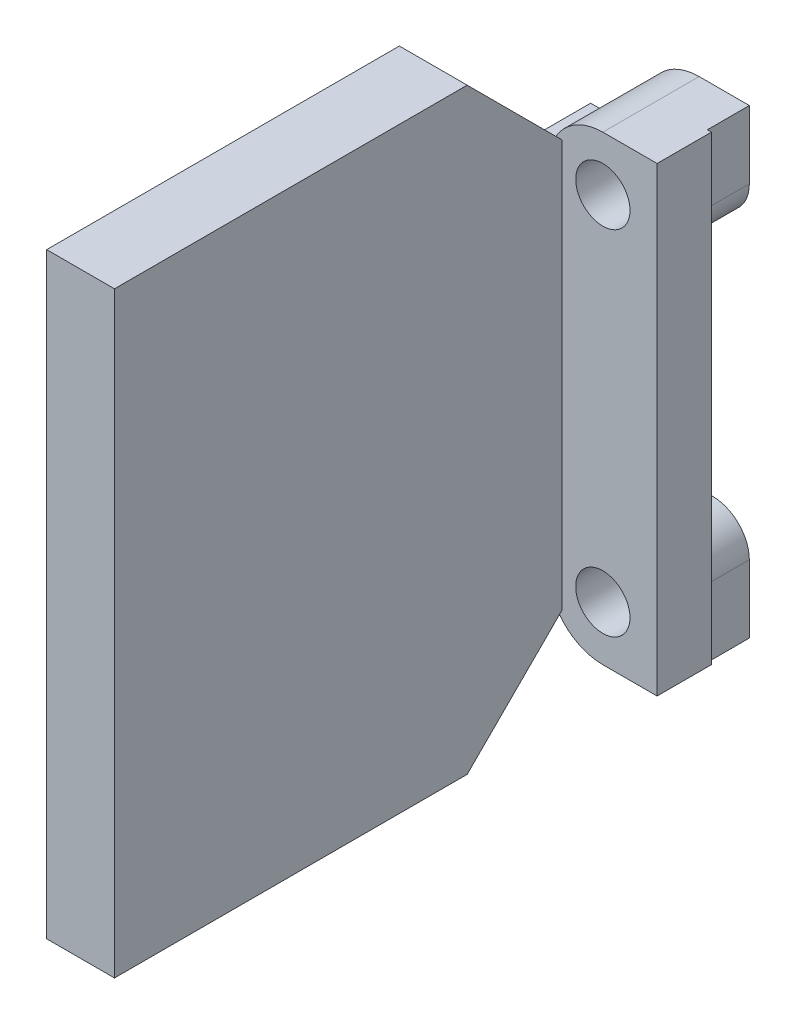
ISO-10303-21;
HEADER;
FILE_DESCRIPTION(('STEP AP214'),'2;1');
FILE_NAME('part.step','',(''),(''),'','','');
FILE_SCHEMA(('AUTOMOTIVE_DESIGN { 1 0 10303 214 1 1 1 1 }'));
ENDSEC;
DATA;
#1=APPLICATION_CONTEXT('core data for automotive mechanical design processes');
#2=APPLICATION_PROTOCOL_DEFINITION('international standard','automotive_design',2000,#1);
#3=PRODUCT_CONTEXT('',#1,'mechanical');
#4=PRODUCT('Part','Part','',(#3));
#5=PRODUCT_RELATED_PRODUCT_CATEGORY('part','',(#4));
#6=PRODUCT_DEFINITION_FORMATION('','',#4);
#7=PRODUCT_DEFINITION_CONTEXT('part definition',#1,'design');
#8=PRODUCT_DEFINITION('design','',#6,#7);
#9=PRODUCT_DEFINITION_SHAPE('','',#8);
#10=(LENGTH_UNIT() NAMED_UNIT(*) SI_UNIT(.MILLI.,.METRE.));
#11=(NAMED_UNIT(*) PLANE_ANGLE_UNIT() SI_UNIT($,.RADIAN.));
#12=(NAMED_UNIT(*) SI_UNIT($,.STERADIAN.) SOLID_ANGLE_UNIT());
#13=UNCERTAINTY_MEASURE_WITH_UNIT(LENGTH_MEASURE(1.E-05),#10,'distance_accuracy_value','');
#14=(GEOMETRIC_REPRESENTATION_CONTEXT(3) GLOBAL_UNCERTAINTY_ASSIGNED_CONTEXT((#13)) GLOBAL_UNIT_ASSIGNED_CONTEXT((#10,
#11,#12)) REPRESENTATION_CONTEXT('',''));
#15=CARTESIAN_POINT('',(0.,0.,0.));
#16=DIRECTION('',(0.,0.,1.));
#17=DIRECTION('',(1.,0.,0.));
#18=AXIS2_PLACEMENT_3D('',#15,#16,#17);
#19=CARTESIAN_POINT('',(-36.0000000000001,13.0000000000001,4.));
#20=DIRECTION('',(0.,0.,1.));
#21=DIRECTION('',(1.,0.,0.));
#22=AXIS2_PLACEMENT_3D('',#19,#20,#21);
#23=PLANE('',#22);
#24=CARTESIAN_POINT('',(-36.0000000000001,13.0000000000001,4.));
#25=DIRECTION('',(0.,0.,1.));
#26=DIRECTION('',(1.,0.,0.));
#27=AXIS2_PLACEMENT_3D('',#24,#25,#26);
#28=CIRCLE('',#27,2.);
#29=CARTESIAN_POINT('',(-34.0000000000001,13.0000000000001,4.));
#30=VERTEX_POINT('',#29);
#31=EDGE_CURVE('E374',#30,#30,#28,.T.);
#32=ORIENTED_EDGE('',*,*,#31,.F.);
#33=EDGE_LOOP('',(#32));
#34=FACE_BOUND('',#33,.T.);
#35=CARTESIAN_POINT('',(-36.0000000000001,13.0000000000001,4.));
#36=DIRECTION('',(0.,0.,1.));
#37=DIRECTION('',(1.,0.,0.));
#38=AXIS2_PLACEMENT_3D('',#35,#36,#37);
#39=CIRCLE('',#38,4.);
#40=CARTESIAN_POINT('',(-36.0000000000001,17.0000000000001,4.));
#41=VERTEX_POINT('',#40);
#42=CARTESIAN_POINT('',(-39.4641016151379,15.,4.));
#43=VERTEX_POINT('',#42);
#44=EDGE_CURVE('E383',#41,#43,#39,.T.);
#45=ORIENTED_EDGE('',*,*,#44,.T.);
#46=DIRECTION('',(1.,0.,0.));
#47=VECTOR('',#46,1.);
#48=CARTESIAN_POINT('',(-36.0000000000001,15.,4.));
#49=LINE('',#48,#47);
#50=CARTESIAN_POINT('',(-39.0000000000001,15.,4.));
#51=VERTEX_POINT('',#50);
#52=EDGE_CURVE('E339',#43,#51,#49,.T.);
#53=ORIENTED_EDGE('',*,*,#52,.T.);
#54=DIRECTION('',(0.,1.,0.));
#55=VECTOR('',#54,1.);
#56=CARTESIAN_POINT('',(-39.0000000000001,13.0000000000001,4.));
#57=LINE('',#56,#55);
#58=CARTESIAN_POINT('',(-39.0000000000001,-15.,4.));
#59=VERTEX_POINT('',#58);
#60=EDGE_CURVE('E333',#59,#51,#57,.T.);
#61=ORIENTED_EDGE('',*,*,#60,.F.);
#62=DIRECTION('',(1.,0.,0.));
#63=VECTOR('',#62,1.);
#64=CARTESIAN_POINT('',(-36.0000000000001,-15.,4.));
#65=LINE('',#64,#63);
#66=CARTESIAN_POINT('',(-39.4641016151379,-15.,4.));
#67=VERTEX_POINT('',#66);
#68=EDGE_CURVE('E220',#67,#59,#65,.T.);
#69=ORIENTED_EDGE('',*,*,#68,.F.);
#70=CARTESIAN_POINT('',(-36.0000000000001,-13.0000000000001,4.));
#71=DIRECTION('',(0.,0.,-1.));
#72=DIRECTION('',(1.,0.,0.));
#73=AXIS2_PLACEMENT_3D('',#70,#71,#72);
#74=CIRCLE('',#73,4.);
#75=CARTESIAN_POINT('',(-36.0000000000001,-17.0000000000001,4.));
#76=VERTEX_POINT('',#75);
#77=EDGE_CURVE('E286',#76,#67,#74,.T.);
#78=ORIENTED_EDGE('',*,*,#77,.F.);
#79=DIRECTION('',(-1.,0.,0.));
#80=VECTOR('',#79,1.);
#81=CARTESIAN_POINT('',(-36.0000000000001,-17.0000000000001,4.));
#82=LINE('',#81,#80);
#83=CARTESIAN_POINT('',(-32.,-17.0000000000001,4.));
#84=VERTEX_POINT('',#83);
#85=EDGE_CURVE('E283',#84,#76,#82,.T.);
#86=ORIENTED_EDGE('',*,*,#85,.F.);
#87=DIRECTION('',(0.,1.,0.));
#88=VECTOR('',#87,1.);
#89=CARTESIAN_POINT('',(-32.,0.,4.));
#90=LINE('',#89,#88);
#91=CARTESIAN_POINT('',(-32.,17.0000000000001,4.));
#92=VERTEX_POINT('',#91);
#93=EDGE_CURVE('E378',#84,#92,#90,.T.);
#94=ORIENTED_EDGE('',*,*,#93,.T.);
#95=DIRECTION('',(-1.,0.,0.));
#96=VECTOR('',#95,1.);
#97=CARTESIAN_POINT('',(-36.0000000000001,17.0000000000001,4.));
#98=LINE('',#97,#96);
#99=EDGE_CURVE('E380',#92,#41,#98,.T.);
#100=ORIENTED_EDGE('',*,*,#99,.T.);
#101=EDGE_LOOP('',(#45,#53,#61,#69,#78,#86,#94,#100));
#102=FACE_BOUND('',#101,.T.);
#103=CARTESIAN_POINT('',(-36.0000000000001,-13.0000000000001,4.));
#104=DIRECTION('',(0.,0.,-1.));
#105=DIRECTION('',(1.,0.,0.));
#106=AXIS2_PLACEMENT_3D('',#103,#104,#105);
#107=CIRCLE('',#106,2.);
#108=CARTESIAN_POINT('',(-34.0000000000001,-13.0000000000001,4.));
#109=VERTEX_POINT('',#108);
#110=EDGE_CURVE('E279',#109,#109,#107,.T.);
#111=ORIENTED_EDGE('',*,*,#110,.T.);
#112=EDGE_LOOP('',(#111));
#113=FACE_BOUND('',#112,.T.);
#114=ADVANCED_FACE('F36',(#34,#102,#113),#23,.T.);
#115=CARTESIAN_POINT('',(-36.0000000000001,13.0000000000001,4.));
#116=DIRECTION('',(0.,0.,-1.));
#117=DIRECTION('',(-1.,0.,0.));
#118=AXIS2_PLACEMENT_3D('',#115,#116,#117);
#119=CYLINDRICAL_SURFACE('',#118,4.);
#120=CARTESIAN_POINT('',(-36.0000000000001,13.0000000000001,2.0000000000001));
#121=DIRECTION('',(0.,-0.707106781186548,0.707106781186547));
#122=DIRECTION('',(0.,-0.707106781186547,-0.707106781186548));
#123=AXIS2_PLACEMENT_3D('',#120,#121,#122);
#124=ELLIPSE('',#123,5.65685424949238,4.);
#125=CARTESIAN_POINT('',(-40.0000000000001,13.0000000000001,2.00000000000011));
#126=VERTEX_POINT('',#125);
#127=EDGE_CURVE('E337',#43,#126,#124,.T.);
#128=ORIENTED_EDGE('',*,*,#127,.F.);
#129=ORIENTED_EDGE('',*,*,#44,.F.);
#130=DIRECTION('',(0.,0.,-1.));
#131=VECTOR('',#130,1.);
#132=CARTESIAN_POINT('',(-36.0000000000001,17.0000000000001,4.));
#133=LINE('',#132,#131);
#134=CARTESIAN_POINT('',(-36.0000000000001,17.0000000000001,-3.1));
#135=VERTEX_POINT('',#134);
#136=EDGE_CURVE('E393',#41,#135,#133,.T.);
#137=ORIENTED_EDGE('',*,*,#136,.T.);
#138=CARTESIAN_POINT('',(-36.0000000000001,13.0000000000001,-3.1));
#139=DIRECTION('',(0.,0.,1.));
#140=DIRECTION('',(1.,0.,0.));
#141=AXIS2_PLACEMENT_3D('',#138,#139,#140);
#142=CIRCLE('',#141,3.99999999999998);
#143=CARTESIAN_POINT('',(-40.0000000000001,13.0000000000001,-3.1));
#144=VERTEX_POINT('',#143);
#145=EDGE_CURVE('E364',#135,#144,#142,.T.);
#146=ORIENTED_EDGE('',*,*,#145,.T.);
#147=DIRECTION('',(0.,0.,-1.));
#148=VECTOR('',#147,1.);
#149=CARTESIAN_POINT('',(-40.0000000000001,13.0000000000001,4.));
#150=LINE('',#149,#148);
#151=EDGE_CURVE('E386',#126,#144,#150,.T.);
#152=ORIENTED_EDGE('',*,*,#151,.F.);
#153=EDGE_LOOP('',(#128,#129,#137,#146,#152));
#154=FACE_BOUND('',#153,.T.);
#155=ADVANCED_FACE('F418',(#154),#119,.T.);
#156=CARTESIAN_POINT('',(-44.0000000000001,13.0000000000001,4.));
#157=DIRECTION('',(0.,0.,-1.));
#158=DIRECTION('',(-1.,0.,0.));
#159=AXIS2_PLACEMENT_3D('',#156,#157,#158);
#160=CYLINDRICAL_SURFACE('',#159,4.);
#161=DIRECTION('',(0.,0.,-1.));
#162=VECTOR('',#161,1.);
#163=CARTESIAN_POINT('',(-40.3792266019539,11.3,4.));
#164=LINE('',#163,#162);
#165=CARTESIAN_POINT('',(-40.3792266019539,11.3,0.299999999999972));
#166=VERTEX_POINT('',#165);
#167=CARTESIAN_POINT('',(-40.3792266019538,11.3,-3.1));
#168=VERTEX_POINT('',#167);
#169=EDGE_CURVE('E335',#166,#168,#164,.T.);
#170=ORIENTED_EDGE('',*,*,#169,.F.);
#171=CARTESIAN_POINT('',(-44.0000000000001,13.0000000000001,2.00000000000013));
#172=DIRECTION('',(0.,-0.707106781186548,0.707106781186547));
#173=DIRECTION('',(0.,-0.707106781186547,-0.707106781186548));
#174=AXIS2_PLACEMENT_3D('',#171,#172,#173);
#175=ELLIPSE('',#174,5.65685424949238,4.);
#176=EDGE_CURVE('E12',#126,#166,#175,.F.);
#177=ORIENTED_EDGE('',*,*,#176,.F.);
#178=ORIENTED_EDGE('',*,*,#151,.T.);
#179=CARTESIAN_POINT('',(-44.0000000000001,13.0000000000001,-3.1));
#180=DIRECTION('',(0.,0.,1.));
#181=DIRECTION('',(1.,0.,0.));
#182=AXIS2_PLACEMENT_3D('',#179,#180,#181);
#183=CIRCLE('',#182,4.00000000000002);
#184=EDGE_CURVE('E349',#144,#168,#183,.F.);
#185=ORIENTED_EDGE('',*,*,#184,.T.);
#186=EDGE_LOOP('',(#170,#177,#178,#185));
#187=FACE_BOUND('',#186,.T.);
#188=ADVANCED_FACE('F470',(#187),#160,.F.);
#189=CARTESIAN_POINT('',(-36.0000000000001,13.0000000000001,0.));
#190=DIRECTION('',(0.,0.,1.));
#191=DIRECTION('',(1.,0.,0.));
#192=AXIS2_PLACEMENT_3D('',#189,#190,#191);
#193=PLANE('',#192);
#194=DIRECTION('',(0.,1.,0.));
#195=VECTOR('',#194,1.);
#196=CARTESIAN_POINT('',(-32.,0.,0.));
#197=LINE('',#196,#195);
#198=CARTESIAN_POINT('',(-32.,-17.0000000000001,0.));
#199=VERTEX_POINT('',#198);
#200=CARTESIAN_POINT('',(-32.,17.0000000000001,0.));
#201=VERTEX_POINT('',#200);
#202=EDGE_CURVE('E377',#199,#201,#197,.T.);
#203=ORIENTED_EDGE('',*,*,#202,.F.);
#204=DIRECTION('',(-1.,0.,0.));
#205=VECTOR('',#204,1.);
#206=CARTESIAN_POINT('',(-36.0000000000001,-17.0000000000001,0.));
#207=LINE('',#206,#205);
#208=CARTESIAN_POINT('',(-32.3,-17.0000000000001,0.));
#209=VERTEX_POINT('',#208);
#210=EDGE_CURVE('E282',#199,#209,#207,.T.);
#211=ORIENTED_EDGE('',*,*,#210,.T.);
#212=DIRECTION('',(0.,1.,0.));
#213=VECTOR('',#212,1.);
#214=CARTESIAN_POINT('',(-32.3,-12.,0.));
#215=LINE('',#214,#213);
#216=CARTESIAN_POINT('',(-32.3,-12.,0.));
#217=VERTEX_POINT('',#216);
#218=EDGE_CURVE('E247',#209,#217,#215,.T.);
#219=ORIENTED_EDGE('',*,*,#218,.T.);
#220=CARTESIAN_POINT('',(-35.,-12.,0.));
#221=DIRECTION('',(0.,0.,1.));
#222=DIRECTION('',(-1.,0.,0.));
#223=AXIS2_PLACEMENT_3D('',#220,#221,#222);
#224=CIRCLE('',#223,2.7);
#225=CARTESIAN_POINT('',(-35.,-9.30000000000001,0.));
#226=VERTEX_POINT('',#225);
#227=EDGE_CURVE('E257',#217,#226,#224,.T.);
#228=ORIENTED_EDGE('',*,*,#227,.T.);
#229=DIRECTION('',(-1.,0.,0.));
#230=VECTOR('',#229,1.);
#231=CARTESIAN_POINT('',(-35.,-9.30000000000001,0.));
#232=LINE('',#231,#230);
#233=CARTESIAN_POINT('',(-44.0000000000001,-9.29999999999998,0.));
#234=VERTEX_POINT('',#233);
#235=EDGE_CURVE('E252',#226,#234,#232,.T.);
#236=ORIENTED_EDGE('',*,*,#235,.T.);
#237=DIRECTION('',(0.,-1.,0.));
#238=VECTOR('',#237,1.);
#239=CARTESIAN_POINT('',(-44.,0.,0.));
#240=LINE('',#239,#238);
#241=CARTESIAN_POINT('',(-44.0000000000001,9.29999999999998,0.));
#242=VERTEX_POINT('',#241);
#243=EDGE_CURVE('E381',#242,#234,#240,.T.);
#244=ORIENTED_EDGE('',*,*,#243,.F.);
#245=DIRECTION('',(-1.,0.,0.));
#246=VECTOR('',#245,1.);
#247=CARTESIAN_POINT('',(-35.,9.30000000000001,0.));
#248=LINE('',#247,#246);
#249=CARTESIAN_POINT('',(-35.,9.30000000000001,0.));
#250=VERTEX_POINT('',#249);
#251=EDGE_CURVE('E56',#250,#242,#248,.T.);
#252=ORIENTED_EDGE('',*,*,#251,.F.);
#253=CARTESIAN_POINT('',(-35.,12.,0.));
#254=DIRECTION('',(0.,0.,-1.));
#255=DIRECTION('',(-1.,0.,0.));
#256=AXIS2_PLACEMENT_3D('',#253,#254,#255);
#257=CIRCLE('',#256,2.7);
#258=CARTESIAN_POINT('',(-32.3,12.,0.));
#259=VERTEX_POINT('',#258);
#260=EDGE_CURVE('E51',#259,#250,#257,.T.);
#261=ORIENTED_EDGE('',*,*,#260,.F.);
#262=DIRECTION('',(0.,-1.,0.));
#263=VECTOR('',#262,1.);
#264=CARTESIAN_POINT('',(-32.3,12.,0.));
#265=LINE('',#264,#263);
#266=CARTESIAN_POINT('',(-32.3,17.0000000000001,0.));
#267=VERTEX_POINT('',#266);
#268=EDGE_CURVE('E343',#267,#259,#265,.T.);
#269=ORIENTED_EDGE('',*,*,#268,.F.);
#270=DIRECTION('',(-1.,0.,0.));
#271=VECTOR('',#270,1.);
#272=CARTESIAN_POINT('',(-36.0000000000001,17.0000000000001,0.));
#273=LINE('',#272,#271);
#274=EDGE_CURVE('E388',#201,#267,#273,.T.);
#275=ORIENTED_EDGE('',*,*,#274,.F.);
#276=EDGE_LOOP('',(#203,#211,#219,#228,#236,#244,#252,#261,#269,#275));
#277=FACE_BOUND('',#276,.T.);
#278=ADVANCED_FACE('F403',(#277),#193,.F.);
#279=CARTESIAN_POINT('',(-32.,0.,4.));
#280=DIRECTION('',(-1.,0.,0.));
#281=DIRECTION('',(0.,0.,1.));
#282=AXIS2_PLACEMENT_3D('',#279,#280,#281);
#283=PLANE('',#282);
#284=ORIENTED_EDGE('',*,*,#202,.T.);
#285=DIRECTION('',(0.,0.,-1.));
#286=VECTOR('',#285,1.);
#287=CARTESIAN_POINT('',(-32.,17.0000000000001,4.));
#288=LINE('',#287,#286);
#289=EDGE_CURVE('E44',#92,#201,#288,.T.);
#290=ORIENTED_EDGE('',*,*,#289,.F.);
#291=ORIENTED_EDGE('',*,*,#93,.F.);
#292=DIRECTION('',(0.,0.,-1.));
#293=VECTOR('',#292,1.);
#294=CARTESIAN_POINT('',(-32.,-17.0000000000001,4.));
#295=LINE('',#294,#293);
#296=EDGE_CURVE('E297',#84,#199,#295,.T.);
#297=ORIENTED_EDGE('',*,*,#296,.T.);
#298=EDGE_LOOP('',(#284,#290,#291,#297));
#299=FACE_BOUND('',#298,.T.);
#300=ADVANCED_FACE('F38',(#299),#283,.F.);
#301=CARTESIAN_POINT('',(-36.0000000000001,17.0000000000001,4.));
#302=DIRECTION('',(0.,-1.,0.));
#303=DIRECTION('',(0.,0.,-1.));
#304=AXIS2_PLACEMENT_3D('',#301,#302,#303);
#305=PLANE('',#304);
#306=ORIENTED_EDGE('',*,*,#274,.T.);
#307=DIRECTION('',(0.,0.,1.));
#308=VECTOR('',#307,1.);
#309=CARTESIAN_POINT('',(-32.3,17.0000000000001,-15.9642108679172));
#310=LINE('',#309,#308);
#311=CARTESIAN_POINT('',(-32.3,17.0000000000001,-3.1));
#312=VERTEX_POINT('',#311);
#313=EDGE_CURVE('E347',#312,#267,#310,.T.);
#314=ORIENTED_EDGE('',*,*,#313,.F.);
#315=DIRECTION('',(-1.,0.,0.));
#316=VECTOR('',#315,1.);
#317=CARTESIAN_POINT('',(-36.0000000000001,17.0000000000001,-3.1));
#318=LINE('',#317,#316);
#319=EDGE_CURVE('E367',#312,#135,#318,.T.);
#320=ORIENTED_EDGE('',*,*,#319,.T.);
#321=ORIENTED_EDGE('',*,*,#136,.F.);
#322=ORIENTED_EDGE('',*,*,#99,.F.);
#323=ORIENTED_EDGE('',*,*,#289,.T.);
#324=EDGE_LOOP('',(#306,#314,#320,#321,#322,#323));
#325=FACE_BOUND('',#324,.T.);
#326=ADVANCED_FACE('F399',(#325),#305,.F.);
#327=CARTESIAN_POINT('',(-44.,0.,4.));
#328=DIRECTION('',(1.,0.,0.));
#329=DIRECTION('',(0.,1.,0.));
#330=AXIS2_PLACEMENT_3D('',#327,#328,#329);
#331=PLANE('',#330);
#332=ORIENTED_EDGE('',*,*,#243,.T.);
#333=DIRECTION('',(0.,0.,-1.));
#334=VECTOR('',#333,1.);
#335=CARTESIAN_POINT('',(-44.0000000000001,-9.29999999999998,0.));
#336=LINE('',#335,#334);
#337=CARTESIAN_POINT('',(-44.0000000000001,-9.29999999999998,-3.1));
#338=VERTEX_POINT('',#337);
#339=EDGE_CURVE('E225',#234,#338,#336,.T.);
#340=ORIENTED_EDGE('',*,*,#339,.T.);
#341=DIRECTION('',(0.,-1.,0.));
#342=VECTOR('',#341,1.);
#343=CARTESIAN_POINT('',(-44.0000000000001,-9.29999999999998,-3.1));
#344=LINE('',#343,#342);
#345=CARTESIAN_POINT('',(-44.0000000000001,-11.3,-3.1));
#346=VERTEX_POINT('',#345);
#347=EDGE_CURVE('E228',#338,#346,#344,.T.);
#348=ORIENTED_EDGE('',*,*,#347,.T.);
#349=DIRECTION('',(0.,0.,1.));
#350=VECTOR('',#349,1.);
#351=CARTESIAN_POINT('',(-44.0000000000001,-11.3,-3.1));
#352=LINE('',#351,#350);
#353=CARTESIAN_POINT('',(-44.0000000000001,-11.3,0.299999999999972));
#354=VERTEX_POINT('',#353);
#355=EDGE_CURVE('E231',#346,#354,#352,.T.);
#356=ORIENTED_EDGE('',*,*,#355,.T.);
#357=DIRECTION('',(0.,-0.707106781186547,0.707106781186548));
#358=VECTOR('',#357,1.);
#359=CARTESIAN_POINT('',(-44.0000000000001,-11.3,0.299999999999972));
#360=LINE('',#359,#358);
#361=CARTESIAN_POINT('',(-44.0000000000001,-22.,11.));
#362=VERTEX_POINT('',#361);
#363=EDGE_CURVE('E222',#354,#362,#360,.T.);
#364=ORIENTED_EDGE('',*,*,#363,.T.);
#365=DIRECTION('',(0.,0.,1.));
#366=VECTOR('',#365,1.);
#367=CARTESIAN_POINT('',(-44.0000000000001,-22.,11.));
#368=LINE('',#367,#366);
#369=CARTESIAN_POINT('',(-44.0000000000001,-22.,37.));
#370=VERTEX_POINT('',#369);
#371=EDGE_CURVE('E212',#362,#370,#368,.T.);
#372=ORIENTED_EDGE('',*,*,#371,.T.);
#373=DIRECTION('',(0.,-1.,0.));
#374=VECTOR('',#373,1.);
#375=CARTESIAN_POINT('',(-44.0000000000001,22.,37.));
#376=LINE('',#375,#374);
#377=CARTESIAN_POINT('',(-44.0000000000001,22.,37.));
#378=VERTEX_POINT('',#377);
#379=EDGE_CURVE('E307',#378,#370,#376,.T.);
#380=ORIENTED_EDGE('',*,*,#379,.F.);
#381=DIRECTION('',(0.,0.,1.));
#382=VECTOR('',#381,1.);
#383=CARTESIAN_POINT('',(-44.0000000000001,22.,11.));
#384=LINE('',#383,#382);
#385=CARTESIAN_POINT('',(-44.0000000000001,22.,11.));
#386=VERTEX_POINT('',#385);
#387=EDGE_CURVE('E321',#386,#378,#384,.T.);
#388=ORIENTED_EDGE('',*,*,#387,.F.);
#389=DIRECTION('',(0.,0.707106781186547,0.707106781186548));
#390=VECTOR('',#389,1.);
#391=CARTESIAN_POINT('',(-44.0000000000001,11.3,0.299999999999972));
#392=LINE('',#391,#390);
#393=CARTESIAN_POINT('',(-44.0000000000001,11.3,0.299999999999972));
#394=VERTEX_POINT('',#393);
#395=EDGE_CURVE('E319',#394,#386,#392,.T.);
#396=ORIENTED_EDGE('',*,*,#395,.F.);
#397=DIRECTION('',(0.,0.,1.));
#398=VECTOR('',#397,1.);
#399=CARTESIAN_POINT('',(-44.0000000000001,11.3,-3.1));
#400=LINE('',#399,#398);
#401=CARTESIAN_POINT('',(-44.0000000000001,11.3,-3.1));
#402=VERTEX_POINT('',#401);
#403=EDGE_CURVE('E316',#402,#394,#400,.T.);
#404=ORIENTED_EDGE('',*,*,#403,.F.);
#405=DIRECTION('',(0.,1.,0.));
#406=VECTOR('',#405,1.);
#407=CARTESIAN_POINT('',(-44.0000000000001,9.29999999999998,-3.1));
#408=LINE('',#407,#406);
#409=CARTESIAN_POINT('',(-44.0000000000001,9.29999999999998,-3.1));
#410=VERTEX_POINT('',#409);
#411=EDGE_CURVE('E313',#410,#402,#408,.T.);
#412=ORIENTED_EDGE('',*,*,#411,.F.);
#413=DIRECTION('',(0.,0.,-1.));
#414=VECTOR('',#413,1.);
#415=CARTESIAN_POINT('',(-44.0000000000001,9.29999999999998,0.));
#416=LINE('',#415,#414);
#417=EDGE_CURVE('E303',#242,#410,#416,.T.);
#418=ORIENTED_EDGE('',*,*,#417,.F.);
#419=EDGE_LOOP('',(#332,#340,#348,#356,#364,#372,#380,#388,#396,#404,#412,#418));
#420=FACE_BOUND('',#419,.T.);
#421=ADVANCED_FACE('F448',(#420),#331,.F.);
#422=CARTESIAN_POINT('',(-36.0000000000001,13.0000000000001,4.));
#423=DIRECTION('',(0.,0.,-1.));
#424=DIRECTION('',(-1.,0.,0.));
#425=AXIS2_PLACEMENT_3D('',#422,#423,#424);
#426=CYLINDRICAL_SURFACE('',#425,2.);
#427=ORIENTED_EDGE('',*,*,#31,.T.);
#428=EDGE_LOOP('',(#427));
#429=FACE_BOUND('',#428,.T.);
#430=CARTESIAN_POINT('',(-36.0000000000001,13.0000000000001,-3.1));
#431=DIRECTION('',(0.,0.,1.));
#432=DIRECTION('',(1.,0.,0.));
#433=AXIS2_PLACEMENT_3D('',#430,#431,#432);
#434=CIRCLE('',#433,2.);
#435=CARTESIAN_POINT('',(-34.0000000000001,13.0000000000001,-3.1));
#436=VERTEX_POINT('',#435);
#437=EDGE_CURVE('E346',#436,#436,#434,.T.);
#438=ORIENTED_EDGE('',*,*,#437,.F.);
#439=EDGE_LOOP('',(#438));
#440=FACE_BOUND('',#439,.T.);
#441=ADVANCED_FACE('F454',(#429,#440),#426,.F.);
#442=CARTESIAN_POINT('',(-35.,12.,-15.9642108679172));
#443=DIRECTION('',(0.,0.,1.));
#444=DIRECTION('',(1.,0.,0.));
#445=AXIS2_PLACEMENT_3D('',#442,#443,#444);
#446=CYLINDRICAL_SURFACE('',#445,2.7);
#447=DIRECTION('',(0.,0.,1.));
#448=VECTOR('',#447,1.);
#449=CARTESIAN_POINT('',(-35.,9.30000000000001,-15.9642108679172));
#450=LINE('',#449,#448);
#451=CARTESIAN_POINT('',(-35.,9.30000000000001,-3.1));
#452=VERTEX_POINT('',#451);
#453=EDGE_CURVE('E350',#452,#250,#450,.T.);
#454=ORIENTED_EDGE('',*,*,#453,.F.);
#455=CARTESIAN_POINT('',(-35.,12.,-3.1));
#456=DIRECTION('',(0.,0.,1.));
#457=DIRECTION('',(1.,0.,0.));
#458=AXIS2_PLACEMENT_3D('',#455,#456,#457);
#459=CIRCLE('',#458,2.7);
#460=CARTESIAN_POINT('',(-32.3,12.,-3.1));
#461=VERTEX_POINT('',#460);
#462=EDGE_CURVE('E342',#452,#461,#459,.T.);
#463=ORIENTED_EDGE('',*,*,#462,.T.);
#464=DIRECTION('',(0.,0.,1.));
#465=VECTOR('',#464,1.);
#466=CARTESIAN_POINT('',(-32.3,12.,-15.9642108679172));
#467=LINE('',#466,#465);
#468=EDGE_CURVE('E353',#461,#259,#467,.T.);
#469=ORIENTED_EDGE('',*,*,#468,.T.);
#470=ORIENTED_EDGE('',*,*,#260,.T.);
#471=EDGE_LOOP('',(#454,#463,#469,#470));
#472=FACE_BOUND('',#471,.T.);
#473=ADVANCED_FACE('F452',(#472),#446,.T.);
#474=CARTESIAN_POINT('',(-35.,9.30000000000001,-15.9642108679172));
#475=DIRECTION('',(0.,1.,0.));
#476=DIRECTION('',(0.,0.,1.));
#477=AXIS2_PLACEMENT_3D('',#474,#475,#476);
#478=PLANE('',#477);
#479=ORIENTED_EDGE('',*,*,#251,.T.);
#480=ORIENTED_EDGE('',*,*,#417,.T.);
#481=DIRECTION('',(1.,0.,0.));
#482=VECTOR('',#481,1.);
#483=CARTESIAN_POINT('',(-35.,9.30000000000001,-3.1));
#484=LINE('',#483,#482);
#485=EDGE_CURVE('E352',#410,#452,#484,.T.);
#486=ORIENTED_EDGE('',*,*,#485,.T.);
#487=ORIENTED_EDGE('',*,*,#453,.T.);
#488=EDGE_LOOP('',(#479,#480,#486,#487));
#489=FACE_BOUND('',#488,.T.);
#490=ADVANCED_FACE('F445',(#489),#478,.F.);
#491=CARTESIAN_POINT('',(-32.3,12.,-15.9642108679172));
#492=DIRECTION('',(-1.,0.,0.));
#493=DIRECTION('',(0.,0.,1.));
#494=AXIS2_PLACEMENT_3D('',#491,#492,#493);
#495=PLANE('',#494);
#496=ORIENTED_EDGE('',*,*,#468,.F.);
#497=DIRECTION('',(0.,1.,0.));
#498=VECTOR('',#497,1.);
#499=CARTESIAN_POINT('',(-32.3,12.,-3.1));
#500=LINE('',#499,#498);
#501=EDGE_CURVE('E357',#461,#312,#500,.T.);
#502=ORIENTED_EDGE('',*,*,#501,.T.);
#503=ORIENTED_EDGE('',*,*,#313,.T.);
#504=ORIENTED_EDGE('',*,*,#268,.T.);
#505=EDGE_LOOP('',(#496,#502,#503,#504));
#506=FACE_BOUND('',#505,.T.);
#507=ADVANCED_FACE('F406',(#506),#495,.F.);
#508=CARTESIAN_POINT('',(-36.0000000000001,13.0000000000001,-3.1));
#509=DIRECTION('',(0.,0.,1.));
#510=DIRECTION('',(0.,-1.,0.));
#511=AXIS2_PLACEMENT_3D('',#508,#509,#510);
#512=PLANE('',#511);
#513=ORIENTED_EDGE('',*,*,#485,.F.);
#514=ORIENTED_EDGE('',*,*,#411,.T.);
#515=DIRECTION('',(-1.,0.,0.));
#516=VECTOR('',#515,1.);
#517=CARTESIAN_POINT('',(-39.0000000000001,11.3,-3.1));
#518=LINE('',#517,#516);
#519=EDGE_CURVE('E331',#168,#402,#518,.T.);
#520=ORIENTED_EDGE('',*,*,#519,.F.);
#521=ORIENTED_EDGE('',*,*,#184,.F.);
#522=ORIENTED_EDGE('',*,*,#145,.F.);
#523=ORIENTED_EDGE('',*,*,#319,.F.);
#524=ORIENTED_EDGE('',*,*,#501,.F.);
#525=ORIENTED_EDGE('',*,*,#462,.F.);
#526=EDGE_LOOP('',(#513,#514,#520,#521,#522,#523,#524,#525));
#527=FACE_BOUND('',#526,.T.);
#528=ORIENTED_EDGE('',*,*,#437,.T.);
#529=EDGE_LOOP('',(#528));
#530=FACE_BOUND('',#529,.T.);
#531=ADVANCED_FACE('F410',(#527,#530),#512,.F.);
#532=CARTESIAN_POINT('',(-39.0000000000001,11.3,-3.1));
#533=DIRECTION('',(0.,-1.,0.));
#534=DIRECTION('',(1.,0.,0.));
#535=AXIS2_PLACEMENT_3D('',#532,#533,#534);
#536=PLANE('',#535);
#537=DIRECTION('',(-1.,0.,0.));
#538=VECTOR('',#537,1.);
#539=CARTESIAN_POINT('',(-39.0000000000001,11.3,0.299999999999972));
#540=LINE('',#539,#538);
#541=EDGE_CURVE('E329',#166,#394,#540,.T.);
#542=ORIENTED_EDGE('',*,*,#541,.F.);
#543=ORIENTED_EDGE('',*,*,#169,.T.);
#544=ORIENTED_EDGE('',*,*,#519,.T.);
#545=ORIENTED_EDGE('',*,*,#403,.T.);
#546=EDGE_LOOP('',(#542,#543,#544,#545));
#547=FACE_BOUND('',#546,.T.);
#548=ADVANCED_FACE('F566',(#547),#536,.F.);
#549=CARTESIAN_POINT('',(-39.0000000000001,11.3,0.299999999999972));
#550=DIRECTION('',(0.,-0.707106781186548,0.707106781186547));
#551=DIRECTION('',(0.,-0.707106781186547,-0.707106781186548));
#552=AXIS2_PLACEMENT_3D('',#549,#550,#551);
#553=PLANE('',#552);
#554=ORIENTED_EDGE('',*,*,#52,.F.);
#555=ORIENTED_EDGE('',*,*,#127,.T.);
#556=ORIENTED_EDGE('',*,*,#176,.T.);
#557=ORIENTED_EDGE('',*,*,#541,.T.);
#558=ORIENTED_EDGE('',*,*,#395,.T.);
#559=DIRECTION('',(-1.,0.,0.));
#560=VECTOR('',#559,1.);
#561=CARTESIAN_POINT('',(-39.0000000000001,22.,11.));
#562=LINE('',#561,#560);
#563=CARTESIAN_POINT('',(-39.0000000000001,22.,11.));
#564=VERTEX_POINT('',#563);
#565=EDGE_CURVE('E326',#564,#386,#562,.T.);
#566=ORIENTED_EDGE('',*,*,#565,.F.);
#567=DIRECTION('',(0.,0.707106781186547,0.707106781186548));
#568=VECTOR('',#567,1.);
#569=CARTESIAN_POINT('',(-39.0000000000001,11.3,0.299999999999972));
#570=LINE('',#569,#568);
#571=EDGE_CURVE('E304',#51,#564,#570,.T.);
#572=ORIENTED_EDGE('',*,*,#571,.F.);
#573=EDGE_LOOP('',(#554,#555,#556,#557,#558,#566,#572));
#574=FACE_BOUND('',#573,.T.);
#575=ADVANCED_FACE('F574',(#574),#553,.F.);
#576=CARTESIAN_POINT('',(-39.0000000000001,22.,11.));
#577=DIRECTION('',(0.,-1.,0.));
#578=DIRECTION('',(1.,0.,0.));
#579=AXIS2_PLACEMENT_3D('',#576,#577,#578);
#580=PLANE('',#579);
#581=ORIENTED_EDGE('',*,*,#387,.T.);
#582=DIRECTION('',(-1.,0.,0.));
#583=VECTOR('',#582,1.);
#584=CARTESIAN_POINT('',(-39.0000000000001,22.,37.));
#585=LINE('',#584,#583);
#586=CARTESIAN_POINT('',(-39.0000000000001,22.,37.));
#587=VERTEX_POINT('',#586);
#588=EDGE_CURVE('E310',#587,#378,#585,.T.);
#589=ORIENTED_EDGE('',*,*,#588,.F.);
#590=DIRECTION('',(0.,0.,1.));
#591=VECTOR('',#590,1.);
#592=CARTESIAN_POINT('',(-39.0000000000001,22.,11.));
#593=LINE('',#592,#591);
#594=EDGE_CURVE('E306',#564,#587,#593,.T.);
#595=ORIENTED_EDGE('',*,*,#594,.F.);
#596=ORIENTED_EDGE('',*,*,#565,.T.);
#597=EDGE_LOOP('',(#581,#589,#595,#596));
#598=FACE_BOUND('',#597,.T.);
#599=ADVANCED_FACE('F583',(#598),#580,.F.);
#600=CARTESIAN_POINT('',(-39.0000000000001,22.,37.));
#601=DIRECTION('',(0.,0.,-1.));
#602=DIRECTION('',(0.,1.,0.));
#603=AXIS2_PLACEMENT_3D('',#600,#601,#602);
#604=PLANE('',#603);
#605=ORIENTED_EDGE('',*,*,#379,.T.);
#606=DIRECTION('',(-1.,0.,0.));
#607=VECTOR('',#606,1.);
#608=CARTESIAN_POINT('',(-39.0000000000001,-22.,37.));
#609=LINE('',#608,#607);
#610=CARTESIAN_POINT('',(-39.0000000000001,-22.,37.));
#611=VERTEX_POINT('',#610);
#612=EDGE_CURVE('E206',#611,#370,#609,.T.);
#613=ORIENTED_EDGE('',*,*,#612,.F.);
#614=DIRECTION('',(0.,-1.,0.));
#615=VECTOR('',#614,1.);
#616=CARTESIAN_POINT('',(-39.0000000000001,22.,37.));
#617=LINE('',#616,#615);
#618=EDGE_CURVE('E202',#587,#611,#617,.T.);
#619=ORIENTED_EDGE('',*,*,#618,.F.);
#620=ORIENTED_EDGE('',*,*,#588,.T.);
#621=EDGE_LOOP('',(#605,#613,#619,#620));
#622=FACE_BOUND('',#621,.T.);
#623=ADVANCED_FACE('F591',(#622),#604,.F.);
#624=CARTESIAN_POINT('',(-39.,-2.82181685425561E-13,0.));
#625=DIRECTION('',(1.,0.,0.));
#626=DIRECTION('',(0.,1.,0.));
#627=AXIS2_PLACEMENT_3D('',#624,#625,#626);
#628=PLANE('',#627);
#629=ORIENTED_EDGE('',*,*,#618,.T.);
#630=DIRECTION('',(0.,0.,1.));
#631=VECTOR('',#630,1.);
#632=CARTESIAN_POINT('',(-39.0000000000001,-22.,11.));
#633=LINE('',#632,#631);
#634=CARTESIAN_POINT('',(-39.0000000000001,-22.,11.));
#635=VERTEX_POINT('',#634);
#636=EDGE_CURVE('E195',#635,#611,#633,.T.);
#637=ORIENTED_EDGE('',*,*,#636,.F.);
#638=DIRECTION('',(0.,-0.707106781186547,0.707106781186548));
#639=VECTOR('',#638,1.);
#640=CARTESIAN_POINT('',(-39.0000000000001,-11.3,0.299999999999972));
#641=LINE('',#640,#639);
#642=EDGE_CURVE('E199',#59,#635,#641,.T.);
#643=ORIENTED_EDGE('',*,*,#642,.F.);
#644=ORIENTED_EDGE('',*,*,#60,.T.);
#645=ORIENTED_EDGE('',*,*,#571,.T.);
#646=ORIENTED_EDGE('',*,*,#594,.T.);
#647=EDGE_LOOP('',(#629,#637,#643,#644,#645,#646));
#648=FACE_BOUND('',#647,.T.);
#649=ADVANCED_FACE('F197',(#648),#628,.T.);
#650=CARTESIAN_POINT('',(-36.0000000000001,-13.0000000000001,4.));
#651=DIRECTION('',(0.,0.,-1.));
#652=DIRECTION('',(-1.,0.,0.));
#653=AXIS2_PLACEMENT_3D('',#650,#651,#652);
#654=CYLINDRICAL_SURFACE('',#653,4.);
#655=CARTESIAN_POINT('',(-36.0000000000001,-13.0000000000001,2.0000000000001));
#656=DIRECTION('',(0.,-0.707106781186548,-0.707106781186547));
#657=DIRECTION('',(0.,0.707106781186547,-0.707106781186548));
#658=AXIS2_PLACEMENT_3D('',#655,#656,#657);
#659=ELLIPSE('',#658,5.65685424949238,4.);
#660=CARTESIAN_POINT('',(-40.0000000000001,-13.0000000000001,2.00000000000011));
#661=VERTEX_POINT('',#660);
#662=EDGE_CURVE('E242',#67,#661,#659,.T.);
#663=ORIENTED_EDGE('',*,*,#662,.T.);
#664=DIRECTION('',(0.,0.,-1.));
#665=VECTOR('',#664,1.);
#666=CARTESIAN_POINT('',(-40.0000000000001,-13.0000000000001,4.));
#667=LINE('',#666,#665);
#668=CARTESIAN_POINT('',(-40.0000000000001,-13.0000000000001,-3.1));
#669=VERTEX_POINT('',#668);
#670=EDGE_CURVE('E289',#661,#669,#667,.T.);
#671=ORIENTED_EDGE('',*,*,#670,.T.);
#672=CARTESIAN_POINT('',(-36.0000000000001,-13.0000000000001,-3.1));
#673=DIRECTION('',(0.,0.,-1.));
#674=DIRECTION('',(1.,0.,0.));
#675=AXIS2_PLACEMENT_3D('',#672,#673,#674);
#676=CIRCLE('',#675,3.99999999999998);
#677=CARTESIAN_POINT('',(-36.0000000000001,-17.0000000000001,-3.1));
#678=VERTEX_POINT('',#677);
#679=EDGE_CURVE('E271',#678,#669,#676,.T.);
#680=ORIENTED_EDGE('',*,*,#679,.F.);
#681=DIRECTION('',(0.,0.,-1.));
#682=VECTOR('',#681,1.);
#683=CARTESIAN_POINT('',(-36.0000000000001,-17.0000000000001,4.));
#684=LINE('',#683,#682);
#685=EDGE_CURVE('E294',#76,#678,#684,.T.);
#686=ORIENTED_EDGE('',*,*,#685,.F.);
#687=ORIENTED_EDGE('',*,*,#77,.T.);
#688=EDGE_LOOP('',(#663,#671,#680,#686,#687));
#689=FACE_BOUND('',#688,.T.);
#690=ADVANCED_FACE('F607',(#689),#654,.T.);
#691=CARTESIAN_POINT('',(-44.0000000000001,-13.0000000000001,4.));
#692=DIRECTION('',(0.,0.,-1.));
#693=DIRECTION('',(-1.,0.,0.));
#694=AXIS2_PLACEMENT_3D('',#691,#692,#693);
#695=CYLINDRICAL_SURFACE('',#694,4.);
#696=DIRECTION('',(0.,0.,-1.));
#697=VECTOR('',#696,1.);
#698=CARTESIAN_POINT('',(-40.3792266019539,-11.3,4.));
#699=LINE('',#698,#697);
#700=CARTESIAN_POINT('',(-40.3792266019539,-11.3,0.299999999999972));
#701=VERTEX_POINT('',#700);
#702=CARTESIAN_POINT('',(-40.3792266019538,-11.3,-3.1));
#703=VERTEX_POINT('',#702);
#704=EDGE_CURVE('E239',#701,#703,#699,.T.);
#705=ORIENTED_EDGE('',*,*,#704,.T.);
#706=CARTESIAN_POINT('',(-44.0000000000001,-13.0000000000001,-3.1));
#707=DIRECTION('',(0.,0.,-1.));
#708=DIRECTION('',(1.,0.,0.));
#709=AXIS2_PLACEMENT_3D('',#706,#707,#708);
#710=CIRCLE('',#709,4.00000000000002);
#711=EDGE_CURVE('E255',#669,#703,#710,.F.);
#712=ORIENTED_EDGE('',*,*,#711,.F.);
#713=ORIENTED_EDGE('',*,*,#670,.F.);
#714=CARTESIAN_POINT('',(-44.0000000000001,-13.0000000000001,2.00000000000013));
#715=DIRECTION('',(0.,-0.707106781186548,-0.707106781186547));
#716=DIRECTION('',(0.,0.707106781186547,-0.707106781186548));
#717=AXIS2_PLACEMENT_3D('',#714,#715,#716);
#718=ELLIPSE('',#717,5.65685424949238,4.);
#719=EDGE_CURVE('E300',#661,#701,#718,.F.);
#720=ORIENTED_EDGE('',*,*,#719,.T.);
#721=EDGE_LOOP('',(#705,#712,#713,#720));
#722=FACE_BOUND('',#721,.T.);
#723=ADVANCED_FACE('F638',(#722),#695,.F.);
#724=CARTESIAN_POINT('',(-36.0000000000001,-17.0000000000001,4.));
#725=DIRECTION('',(0.,1.,0.));
#726=DIRECTION('',(0.,0.,-1.));
#727=AXIS2_PLACEMENT_3D('',#724,#725,#726);
#728=PLANE('',#727);
#729=ORIENTED_EDGE('',*,*,#210,.F.);
#730=ORIENTED_EDGE('',*,*,#296,.F.);
#731=ORIENTED_EDGE('',*,*,#85,.T.);
#732=ORIENTED_EDGE('',*,*,#685,.T.);
#733=DIRECTION('',(-1.,0.,0.));
#734=VECTOR('',#733,1.);
#735=CARTESIAN_POINT('',(-36.0000000000001,-17.0000000000001,-3.1));
#736=LINE('',#735,#734);
#737=CARTESIAN_POINT('',(-32.3,-17.0000000000001,-3.1));
#738=VERTEX_POINT('',#737);
#739=EDGE_CURVE('E274',#738,#678,#736,.T.);
#740=ORIENTED_EDGE('',*,*,#739,.F.);
#741=DIRECTION('',(0.,0.,1.));
#742=VECTOR('',#741,1.);
#743=CARTESIAN_POINT('',(-32.3,-17.0000000000001,-15.9642108679172));
#744=LINE('',#743,#742);
#745=EDGE_CURVE('E251',#738,#209,#744,.T.);
#746=ORIENTED_EDGE('',*,*,#745,.T.);
#747=EDGE_LOOP('',(#729,#730,#731,#732,#740,#746));
#748=FACE_BOUND('',#747,.T.);
#749=ADVANCED_FACE('F426',(#748),#728,.F.);
#750=CARTESIAN_POINT('',(-36.0000000000001,-13.0000000000001,4.));
#751=DIRECTION('',(0.,0.,-1.));
#752=DIRECTION('',(-1.,0.,0.));
#753=AXIS2_PLACEMENT_3D('',#750,#751,#752);
#754=CYLINDRICAL_SURFACE('',#753,2.);
#755=ORIENTED_EDGE('',*,*,#110,.F.);
#756=EDGE_LOOP('',(#755));
#757=FACE_BOUND('',#756,.T.);
#758=CARTESIAN_POINT('',(-36.0000000000001,-13.0000000000001,-3.1));
#759=DIRECTION('',(0.,0.,-1.));
#760=DIRECTION('',(1.,0.,0.));
#761=AXIS2_PLACEMENT_3D('',#758,#759,#760);
#762=CIRCLE('',#761,2.);
#763=CARTESIAN_POINT('',(-34.0000000000001,-13.0000000000001,-3.1));
#764=VERTEX_POINT('',#763);
#765=EDGE_CURVE('E250',#764,#764,#762,.T.);
#766=ORIENTED_EDGE('',*,*,#765,.T.);
#767=EDGE_LOOP('',(#766));
#768=FACE_BOUND('',#767,.T.);
#769=ADVANCED_FACE('F659',(#757,#768),#754,.F.);
#770=CARTESIAN_POINT('',(-35.,-12.,-15.9642108679172));
#771=DIRECTION('',(0.,0.,1.));
#772=DIRECTION('',(1.,0.,0.));
#773=AXIS2_PLACEMENT_3D('',#770,#771,#772);
#774=CYLINDRICAL_SURFACE('',#773,2.7);
#775=DIRECTION('',(0.,0.,1.));
#776=VECTOR('',#775,1.);
#777=CARTESIAN_POINT('',(-35.,-9.30000000000001,-15.9642108679172));
#778=LINE('',#777,#776);
#779=CARTESIAN_POINT('',(-35.,-9.30000000000001,-3.1));
#780=VERTEX_POINT('',#779);
#781=EDGE_CURVE('E256',#780,#226,#778,.T.);
#782=ORIENTED_EDGE('',*,*,#781,.T.);
#783=ORIENTED_EDGE('',*,*,#227,.F.);
#784=DIRECTION('',(0.,0.,1.));
#785=VECTOR('',#784,1.);
#786=CARTESIAN_POINT('',(-32.3,-12.,-15.9642108679172));
#787=LINE('',#786,#785);
#788=CARTESIAN_POINT('',(-32.3,-12.,-3.1));
#789=VERTEX_POINT('',#788);
#790=EDGE_CURVE('E261',#789,#217,#787,.T.);
#791=ORIENTED_EDGE('',*,*,#790,.F.);
#792=CARTESIAN_POINT('',(-35.,-12.,-3.1));
#793=DIRECTION('',(0.,0.,-1.));
#794=DIRECTION('',(1.,0.,0.));
#795=AXIS2_PLACEMENT_3D('',#792,#793,#794);
#796=CIRCLE('',#795,2.7);
#797=EDGE_CURVE('E246',#780,#789,#796,.T.);
#798=ORIENTED_EDGE('',*,*,#797,.F.);
#799=EDGE_LOOP('',(#782,#783,#791,#798));
#800=FACE_BOUND('',#799,.T.);
#801=ADVANCED_FACE('F436',(#800),#774,.T.);
#802=CARTESIAN_POINT('',(-35.,-9.30000000000001,-15.9642108679172));
#803=DIRECTION('',(0.,-1.,0.));
#804=DIRECTION('',(0.,0.,1.));
#805=AXIS2_PLACEMENT_3D('',#802,#803,#804);
#806=PLANE('',#805);
#807=ORIENTED_EDGE('',*,*,#235,.F.);
#808=ORIENTED_EDGE('',*,*,#781,.F.);
#809=DIRECTION('',(1.,0.,0.));
#810=VECTOR('',#809,1.);
#811=CARTESIAN_POINT('',(-35.,-9.30000000000001,-3.1));
#812=LINE('',#811,#810);
#813=EDGE_CURVE('E260',#338,#780,#812,.T.);
#814=ORIENTED_EDGE('',*,*,#813,.F.);
#815=ORIENTED_EDGE('',*,*,#339,.F.);
#816=EDGE_LOOP('',(#807,#808,#814,#815));
#817=FACE_BOUND('',#816,.T.);
#818=ADVANCED_FACE('F441',(#817),#806,.F.);
#819=CARTESIAN_POINT('',(-32.3,-12.,-15.9642108679172));
#820=DIRECTION('',(-1.,0.,0.));
#821=DIRECTION('',(0.,0.,1.));
#822=AXIS2_PLACEMENT_3D('',#819,#820,#821);
#823=PLANE('',#822);
#824=ORIENTED_EDGE('',*,*,#790,.T.);
#825=ORIENTED_EDGE('',*,*,#218,.F.);
#826=ORIENTED_EDGE('',*,*,#745,.F.);
#827=DIRECTION('',(0.,-1.,0.));
#828=VECTOR('',#827,1.);
#829=CARTESIAN_POINT('',(-32.3,-12.,-3.1));
#830=LINE('',#829,#828);
#831=EDGE_CURVE('E264',#789,#738,#830,.T.);
#832=ORIENTED_EDGE('',*,*,#831,.F.);
#833=EDGE_LOOP('',(#824,#825,#826,#832));
#834=FACE_BOUND('',#833,.T.);
#835=ADVANCED_FACE('F432',(#834),#823,.F.);
#836=CARTESIAN_POINT('',(-36.0000000000001,-13.0000000000001,-3.1));
#837=DIRECTION('',(0.,0.,1.));
#838=DIRECTION('',(0.,1.,0.));
#839=AXIS2_PLACEMENT_3D('',#836,#837,#838);
#840=PLANE('',#839);
#841=ORIENTED_EDGE('',*,*,#813,.T.);
#842=ORIENTED_EDGE('',*,*,#797,.T.);
#843=ORIENTED_EDGE('',*,*,#831,.T.);
#844=ORIENTED_EDGE('',*,*,#739,.T.);
#845=ORIENTED_EDGE('',*,*,#679,.T.);
#846=ORIENTED_EDGE('',*,*,#711,.T.);
#847=DIRECTION('',(-1.,0.,0.));
#848=VECTOR('',#847,1.);
#849=CARTESIAN_POINT('',(-39.0000000000001,-11.3,-3.1));
#850=LINE('',#849,#848);
#851=EDGE_CURVE('E237',#703,#346,#850,.T.);
#852=ORIENTED_EDGE('',*,*,#851,.T.);
#853=ORIENTED_EDGE('',*,*,#347,.F.);
#854=EDGE_LOOP('',(#841,#842,#843,#844,#845,#846,#852,#853));
#855=FACE_BOUND('',#854,.T.);
#856=ORIENTED_EDGE('',*,*,#765,.F.);
#857=EDGE_LOOP('',(#856));
#858=FACE_BOUND('',#857,.T.);
#859=ADVANCED_FACE('F695',(#855,#858),#840,.F.);
#860=CARTESIAN_POINT('',(-39.0000000000001,-11.3,-3.1));
#861=DIRECTION('',(0.,1.,0.));
#862=DIRECTION('',(1.,0.,0.));
#863=AXIS2_PLACEMENT_3D('',#860,#861,#862);
#864=PLANE('',#863);
#865=DIRECTION('',(-1.,0.,0.));
#866=VECTOR('',#865,1.);
#867=CARTESIAN_POINT('',(-39.0000000000001,-11.3,0.299999999999972));
#868=LINE('',#867,#866);
#869=EDGE_CURVE('E216',#701,#354,#868,.T.);
#870=ORIENTED_EDGE('',*,*,#869,.T.);
#871=ORIENTED_EDGE('',*,*,#355,.F.);
#872=ORIENTED_EDGE('',*,*,#851,.F.);
#873=ORIENTED_EDGE('',*,*,#704,.F.);
#874=EDGE_LOOP('',(#870,#871,#872,#873));
#875=FACE_BOUND('',#874,.T.);
#876=ADVANCED_FACE('F705',(#875),#864,.F.);
#877=CARTESIAN_POINT('',(-39.0000000000001,-11.3,0.299999999999972));
#878=DIRECTION('',(0.,0.707106781186548,0.707106781186547));
#879=DIRECTION('',(0.,0.707106781186547,-0.707106781186548));
#880=AXIS2_PLACEMENT_3D('',#877,#878,#879);
#881=PLANE('',#880);
#882=ORIENTED_EDGE('',*,*,#68,.T.);
#883=ORIENTED_EDGE('',*,*,#642,.T.);
#884=DIRECTION('',(-1.,0.,0.));
#885=VECTOR('',#884,1.);
#886=CARTESIAN_POINT('',(-39.0000000000001,-22.,11.));
#887=LINE('',#886,#885);
#888=EDGE_CURVE('E209',#635,#362,#887,.T.);
#889=ORIENTED_EDGE('',*,*,#888,.T.);
#890=ORIENTED_EDGE('',*,*,#363,.F.);
#891=ORIENTED_EDGE('',*,*,#869,.F.);
#892=ORIENTED_EDGE('',*,*,#719,.F.);
#893=ORIENTED_EDGE('',*,*,#662,.F.);
#894=EDGE_LOOP('',(#882,#883,#889,#890,#891,#892,#893));
#895=FACE_BOUND('',#894,.T.);
#896=ADVANCED_FACE('F218',(#895),#881,.F.);
#897=CARTESIAN_POINT('',(-39.0000000000001,-22.,11.));
#898=DIRECTION('',(0.,1.,0.));
#899=DIRECTION('',(1.,0.,0.));
#900=AXIS2_PLACEMENT_3D('',#897,#898,#899);
#901=PLANE('',#900);
#902=ORIENTED_EDGE('',*,*,#371,.F.);
#903=ORIENTED_EDGE('',*,*,#888,.F.);
#904=ORIENTED_EDGE('',*,*,#636,.T.);
#905=ORIENTED_EDGE('',*,*,#612,.T.);
#906=EDGE_LOOP('',(#902,#903,#904,#905));
#907=FACE_BOUND('',#906,.T.);
#908=ADVANCED_FACE('F210',(#907),#901,.F.);
#909=CLOSED_SHELL('',(#114,#155,#188,#278,#300,#326,#421,#441,#473,#490,#507,#531,#548,#575,
#599,#623,#649,#690,#723,#749,#769,#801,#818,#835,#859,#876,#896,#908));
#910=MANIFOLD_SOLID_BREP('B2',#909);
#911=ADVANCED_BREP_SHAPE_REPRESENTATION('',(#18,#910),#14);
#912=SHAPE_DEFINITION_REPRESENTATION(#9,#911);
ENDSEC;
END-ISO-10303-21;
